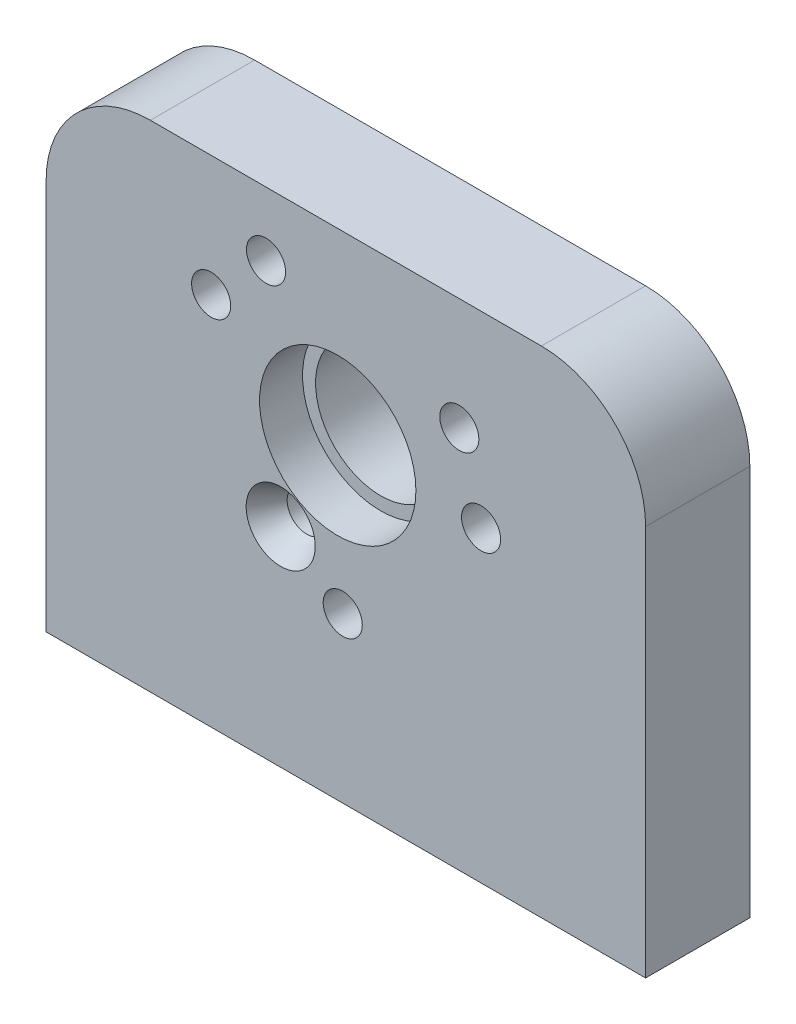
ISO-10303-21;
HEADER;
FILE_DESCRIPTION(('STEP AP214'),'2;1');
FILE_NAME('part.step','',(''),(''),'','','');
FILE_SCHEMA(('AUTOMOTIVE_DESIGN { 1 0 10303 214 1 1 1 1 }'));
ENDSEC;
DATA;
#1=APPLICATION_CONTEXT('core data for automotive mechanical design processes');
#2=APPLICATION_PROTOCOL_DEFINITION('international standard','automotive_design',2000,#1);
#3=PRODUCT_CONTEXT('',#1,'mechanical');
#4=PRODUCT('Part','Part','',(#3));
#5=PRODUCT_RELATED_PRODUCT_CATEGORY('part','',(#4));
#6=PRODUCT_DEFINITION_FORMATION('','',#4);
#7=PRODUCT_DEFINITION_CONTEXT('part definition',#1,'design');
#8=PRODUCT_DEFINITION('design','',#6,#7);
#9=PRODUCT_DEFINITION_SHAPE('','',#8);
#10=(LENGTH_UNIT() NAMED_UNIT(*) SI_UNIT(.MILLI.,.METRE.));
#11=(NAMED_UNIT(*) PLANE_ANGLE_UNIT() SI_UNIT($,.RADIAN.));
#12=(NAMED_UNIT(*) SI_UNIT($,.STERADIAN.) SOLID_ANGLE_UNIT());
#13=UNCERTAINTY_MEASURE_WITH_UNIT(LENGTH_MEASURE(1.E-05),#10,'distance_accuracy_value','');
#14=(GEOMETRIC_REPRESENTATION_CONTEXT(3) GLOBAL_UNCERTAINTY_ASSIGNED_CONTEXT((#13)) GLOBAL_UNIT_ASSIGNED_CONTEXT((#10,
#11,#12)) REPRESENTATION_CONTEXT('',''));
#15=CARTESIAN_POINT('',(0.,0.,0.));
#16=DIRECTION('',(0.,0.,1.));
#17=DIRECTION('',(1.,0.,0.));
#18=AXIS2_PLACEMENT_3D('',#15,#16,#17);
#19=CARTESIAN_POINT('',(0.,0.,-3.5));
#20=DIRECTION('',(0.,0.,1.));
#21=DIRECTION('',(1.,0.,0.));
#22=AXIS2_PLACEMENT_3D('',#19,#20,#21);
#23=PLANE('',#22);
#24=CARTESIAN_POINT('',(-6.12499999999999,15.1040017247427,-3.5));
#25=DIRECTION('',(0.,0.,-1.));
#26=DIRECTION('',(-1.,0.,0.));
#27=AXIS2_PLACEMENT_3D('',#24,#25,#26);
#28=CIRCLE('',#27,2.7);
#29=CARTESIAN_POINT('',(-8.82499999999999,15.1040017247427,-3.5));
#30=VERTEX_POINT('',#29);
#31=EDGE_CURVE('E744',#30,#30,#28,.T.);
#32=ORIENTED_EDGE('',*,*,#31,.F.);
#33=EDGE_LOOP('',(#32));
#34=FACE_BOUND('',#33,.T.);
#35=CARTESIAN_POINT('',(10.375,5.57772228311383,-3.5));
#36=DIRECTION('',(0.,0.,-1.));
#37=DIRECTION('',(-1.,0.,0.));
#38=AXIS2_PLACEMENT_3D('',#35,#36,#37);
#39=CIRCLE('',#38,2.7);
#40=CARTESIAN_POINT('',(7.67500000000001,5.57772228311383,-3.5));
#41=VERTEX_POINT('',#40);
#42=EDGE_CURVE('E273',#41,#41,#39,.T.);
#43=ORIENTED_EDGE('',*,*,#42,.F.);
#44=EDGE_LOOP('',(#43));
#45=FACE_BOUND('',#44,.T.);
#46=CARTESIAN_POINT('',(-0.241105536265653,-5.41557681429202,-3.5));
#47=DIRECTION('',(0.,0.,-1.));
#48=DIRECTION('',(-1.,0.,0.));
#49=AXIS2_PLACEMENT_3D('',#46,#47,#48);
#50=CIRCLE('',#49,2.7);
#51=CARTESIAN_POINT('',(-2.94110553626565,-5.41557681429202,-3.5));
#52=VERTEX_POINT('',#51);
#53=EDGE_CURVE('E226',#52,#52,#50,.T.);
#54=ORIENTED_EDGE('',*,*,#53,.F.);
#55=EDGE_LOOP('',(#54));
#56=FACE_BOUND('',#55,.T.);
#57=CARTESIAN_POINT('',(8.70352905788683,11.4068341897829,-3.5));
#58=DIRECTION('',(0.,0.,-1.));
#59=DIRECTION('',(-1.,0.,0.));
#60=AXIS2_PLACEMENT_3D('',#57,#58,#59);
#61=CIRCLE('',#60,2.7);
#62=CARTESIAN_POINT('',(6.00352905788683,11.4068341897829,-3.5));
#63=VERTEX_POINT('',#62);
#64=EDGE_CURVE('E266',#63,#63,#61,.T.);
#65=ORIENTED_EDGE('',*,*,#64,.F.);
#66=EDGE_LOOP('',(#65));
#67=FACE_BOUND('',#66,.T.);
#68=CARTESIAN_POINT('',(-10.3374235216212,10.7419094738506,-3.5));
#69=DIRECTION('',(0.,0.,-1.));
#70=DIRECTION('',(-1.,0.,0.));
#71=AXIS2_PLACEMENT_3D('',#68,#69,#70);
#72=CIRCLE('',#71,2.7);
#73=CARTESIAN_POINT('',(-13.0374235216212,10.7419094738506,-3.5));
#74=VERTEX_POINT('',#73);
#75=EDGE_CURVE('E231',#74,#74,#72,.T.);
#76=ORIENTED_EDGE('',*,*,#75,.F.);
#77=EDGE_LOOP('',(#76));
#78=FACE_BOUND('',#77,.T.);
#79=DIRECTION('',(-1.,0.,0.));
#80=VECTOR('',#79,1.);
#81=CARTESIAN_POINT('',(23.,20.,-3.5));
#82=LINE('',#81,#80);
#83=CARTESIAN_POINT('',(15.,20.,-3.5));
#84=VERTEX_POINT('',#83);
#85=CARTESIAN_POINT('',(-15.,20.,-3.5));
#86=VERTEX_POINT('',#85);
#87=EDGE_CURVE('E175',#84,#86,#82,.T.);
#88=ORIENTED_EDGE('',*,*,#87,.F.);
#89=CARTESIAN_POINT('',(15.,12.,-3.5));
#90=DIRECTION('',(0.,0.,1.));
#91=DIRECTION('',(1.,0.,0.));
#92=AXIS2_PLACEMENT_3D('',#89,#90,#91);
#93=CIRCLE('',#92,8.);
#94=CARTESIAN_POINT('',(23.,12.,-3.5));
#95=VERTEX_POINT('',#94);
#96=EDGE_CURVE('E208',#84,#95,#93,.F.);
#97=ORIENTED_EDGE('',*,*,#96,.T.);
#98=DIRECTION('',(0.,1.,0.));
#99=VECTOR('',#98,1.);
#100=CARTESIAN_POINT('',(23.,-18.,-3.5));
#101=LINE('',#100,#99);
#102=CARTESIAN_POINT('',(23.,-18.,-3.5));
#103=VERTEX_POINT('',#102);
#104=EDGE_CURVE('E171',#103,#95,#101,.T.);
#105=ORIENTED_EDGE('',*,*,#104,.F.);
#106=DIRECTION('',(1.,0.,0.));
#107=VECTOR('',#106,1.);
#108=CARTESIAN_POINT('',(-23.,-18.,-3.5));
#109=LINE('',#108,#107);
#110=CARTESIAN_POINT('',(-23.,-18.,-3.5));
#111=VERTEX_POINT('',#110);
#112=EDGE_CURVE('E168',#111,#103,#109,.T.);
#113=ORIENTED_EDGE('',*,*,#112,.F.);
#114=DIRECTION('',(0.,-1.,0.));
#115=VECTOR('',#114,1.);
#116=CARTESIAN_POINT('',(-23.,20.,-3.5));
#117=LINE('',#116,#115);
#118=CARTESIAN_POINT('',(-23.,12.,-3.5));
#119=VERTEX_POINT('',#118);
#120=EDGE_CURVE('E178',#119,#111,#117,.T.);
#121=ORIENTED_EDGE('',*,*,#120,.F.);
#122=CARTESIAN_POINT('',(-15.,12.,-3.5));
#123=DIRECTION('',(0.,0.,1.));
#124=DIRECTION('',(1.,0.,0.));
#125=AXIS2_PLACEMENT_3D('',#122,#123,#124);
#126=CIRCLE('',#125,8.);
#127=EDGE_CURVE('E206',#119,#86,#126,.F.);
#128=ORIENTED_EDGE('',*,*,#127,.T.);
#129=EDGE_LOOP('',(#88,#97,#105,#113,#121,#128));
#130=FACE_BOUND('',#129,.T.);
#131=CARTESIAN_POINT('',(-0.625000000000001,5.57772228311384,-3.5));
#132=DIRECTION('',(0.,0.,1.));
#133=DIRECTION('',(1.,0.,0.));
#134=AXIS2_PLACEMENT_3D('',#131,#132,#133);
#135=CIRCLE('',#134,5.00000000000001);
#136=CARTESIAN_POINT('',(4.37500000000001,5.57772228311384,-3.5));
#137=VERTEX_POINT('',#136);
#138=EDGE_CURVE('E299',#137,#137,#135,.T.);
#139=ORIENTED_EDGE('',*,*,#138,.T.);
#140=EDGE_LOOP('',(#139));
#141=FACE_BOUND('',#140,.T.);
#142=DIRECTION('',(-1.,0.,0.));
#143=VECTOR('',#142,1.);
#144=CARTESIAN_POINT('',(-2.5,-4.5,-3.5));
#145=LINE('',#144,#143);
#146=CARTESIAN_POINT('',(-3.5,-4.5,-3.5));
#147=VERTEX_POINT('',#146);
#148=CARTESIAN_POINT('',(-6.5,-4.5,-3.5));
#149=VERTEX_POINT('',#148);
#150=EDGE_CURVE('E311',#147,#149,#145,.T.);
#151=ORIENTED_EDGE('',*,*,#150,.F.);
#152=CARTESIAN_POINT('',(-3.5,-3.5,-3.5));
#153=DIRECTION('',(0.,0.,1.));
#154=DIRECTION('',(1.,0.,0.));
#155=AXIS2_PLACEMENT_3D('',#152,#153,#154);
#156=CIRCLE('',#155,1.);
#157=CARTESIAN_POINT('',(-2.5,-3.5,-3.5));
#158=VERTEX_POINT('',#157);
#159=EDGE_CURVE('E260',#147,#158,#156,.T.);
#160=ORIENTED_EDGE('',*,*,#159,.T.);
#161=DIRECTION('',(0.,-1.,0.));
#162=VECTOR('',#161,1.);
#163=CARTESIAN_POINT('',(-2.5,-4.5,-3.5));
#164=LINE('',#163,#162);
#165=CARTESIAN_POINT('',(-2.5,-0.500000000000002,-3.5));
#166=VERTEX_POINT('',#165);
#167=EDGE_CURVE('E323',#166,#158,#164,.T.);
#168=ORIENTED_EDGE('',*,*,#167,.F.);
#169=CARTESIAN_POINT('',(-3.5,-0.500000000000002,-3.5));
#170=DIRECTION('',(0.,0.,1.));
#171=DIRECTION('',(1.,0.,0.));
#172=AXIS2_PLACEMENT_3D('',#169,#170,#171);
#173=CIRCLE('',#172,1.);
#174=CARTESIAN_POINT('',(-3.5,0.499999999999998,-3.5));
#175=VERTEX_POINT('',#174);
#176=EDGE_CURVE('E11',#166,#175,#173,.T.);
#177=ORIENTED_EDGE('',*,*,#176,.T.);
#178=DIRECTION('',(1.,0.,0.));
#179=VECTOR('',#178,1.);
#180=CARTESIAN_POINT('',(-2.5,0.499999999999998,-3.5));
#181=LINE('',#180,#179);
#182=CARTESIAN_POINT('',(-6.5,0.499999999999998,-3.5));
#183=VERTEX_POINT('',#182);
#184=EDGE_CURVE('E321',#183,#175,#181,.T.);
#185=ORIENTED_EDGE('',*,*,#184,.F.);
#186=CARTESIAN_POINT('',(-6.5,-0.500000000000002,-3.5));
#187=DIRECTION('',(0.,0.,1.));
#188=DIRECTION('',(1.,0.,0.));
#189=AXIS2_PLACEMENT_3D('',#186,#187,#188);
#190=CIRCLE('',#189,1.);
#191=CARTESIAN_POINT('',(-7.5,-0.500000000000001,-3.5));
#192=VERTEX_POINT('',#191);
#193=EDGE_CURVE('E44',#183,#192,#190,.T.);
#194=ORIENTED_EDGE('',*,*,#193,.T.);
#195=DIRECTION('',(0.,1.,0.));
#196=VECTOR('',#195,1.);
#197=CARTESIAN_POINT('',(-7.5,-4.5,-3.5));
#198=LINE('',#197,#196);
#199=CARTESIAN_POINT('',(-7.5,-3.5,-3.5));
#200=VERTEX_POINT('',#199);
#201=EDGE_CURVE('E216',#200,#192,#198,.T.);
#202=ORIENTED_EDGE('',*,*,#201,.F.);
#203=CARTESIAN_POINT('',(-6.5,-3.5,-3.5));
#204=DIRECTION('',(0.,0.,1.));
#205=DIRECTION('',(1.,0.,0.));
#206=AXIS2_PLACEMENT_3D('',#203,#204,#205);
#207=CIRCLE('',#206,1.);
#208=EDGE_CURVE('E262',#200,#149,#207,.T.);
#209=ORIENTED_EDGE('',*,*,#208,.T.);
#210=EDGE_LOOP('',(#151,#160,#168,#177,#185,#194,#202,#209));
#211=FACE_BOUND('',#210,.T.);
#212=ADVANCED_FACE('F34',(#34,#45,#56,#67,#78,#130,#141,#211),#23,.F.);
#213=CARTESIAN_POINT('',(-23.,-18.,-3.5));
#214=DIRECTION('',(0.,-1.,0.));
#215=DIRECTION('',(0.,0.,-1.));
#216=AXIS2_PLACEMENT_3D('',#213,#214,#215);
#217=PLANE('',#216);
#218=CARTESIAN_POINT('',(-19.,-18.,0.5));
#219=DIRECTION('',(0.,-1.,0.));
#220=DIRECTION('',(0.,0.,-1.));
#221=AXIS2_PLACEMENT_3D('',#218,#219,#220);
#222=CIRCLE('',#221,1.24999999999999);
#223=CARTESIAN_POINT('',(-19.,-18.,-0.74999999999999));
#224=VERTEX_POINT('',#223);
#225=EDGE_CURVE('E149',#224,#224,#222,.T.);
#226=ORIENTED_EDGE('',*,*,#225,.F.);
#227=EDGE_LOOP('',(#226));
#228=FACE_BOUND('',#227,.T.);
#229=CARTESIAN_POINT('',(19.,-18.,0.5));
#230=DIRECTION('',(0.,-1.,0.));
#231=DIRECTION('',(0.,0.,-1.));
#232=AXIS2_PLACEMENT_3D('',#229,#230,#231);
#233=CIRCLE('',#232,1.24999999999999);
#234=CARTESIAN_POINT('',(19.,-18.,-0.74999999999999));
#235=VERTEX_POINT('',#234);
#236=EDGE_CURVE('E148',#235,#235,#233,.T.);
#237=ORIENTED_EDGE('',*,*,#236,.F.);
#238=EDGE_LOOP('',(#237));
#239=FACE_BOUND('',#238,.T.);
#240=CARTESIAN_POINT('',(0.,-18.,0.5));
#241=DIRECTION('',(0.,-1.,0.));
#242=DIRECTION('',(0.,0.,-1.));
#243=AXIS2_PLACEMENT_3D('',#240,#241,#242);
#244=CIRCLE('',#243,1.25);
#245=CARTESIAN_POINT('',(0.,-18.,-0.749999999999998));
#246=VERTEX_POINT('',#245);
#247=EDGE_CURVE('E161',#246,#246,#244,.T.);
#248=ORIENTED_EDGE('',*,*,#247,.F.);
#249=EDGE_LOOP('',(#248));
#250=FACE_BOUND('',#249,.T.);
#251=DIRECTION('',(1.,0.,0.));
#252=VECTOR('',#251,1.);
#253=CARTESIAN_POINT('',(-23.,-18.,4.5));
#254=LINE('',#253,#252);
#255=CARTESIAN_POINT('',(-23.,-18.,4.5));
#256=VERTEX_POINT('',#255);
#257=CARTESIAN_POINT('',(23.,-18.,4.5));
#258=VERTEX_POINT('',#257);
#259=EDGE_CURVE('E167',#256,#258,#254,.T.);
#260=ORIENTED_EDGE('',*,*,#259,.F.);
#261=DIRECTION('',(0.,0.,1.));
#262=VECTOR('',#261,1.);
#263=CARTESIAN_POINT('',(-23.,-18.,-3.5));
#264=LINE('',#263,#262);
#265=EDGE_CURVE('E190',#111,#256,#264,.T.);
#266=ORIENTED_EDGE('',*,*,#265,.F.);
#267=ORIENTED_EDGE('',*,*,#112,.T.);
#268=DIRECTION('',(0.,0.,1.));
#269=VECTOR('',#268,1.);
#270=CARTESIAN_POINT('',(23.,-18.,-3.5));
#271=LINE('',#270,#269);
#272=EDGE_CURVE('E180',#103,#258,#271,.T.);
#273=ORIENTED_EDGE('',*,*,#272,.T.);
#274=EDGE_LOOP('',(#260,#266,#267,#273));
#275=FACE_BOUND('',#274,.T.);
#276=ADVANCED_FACE('F363',(#228,#239,#250,#275),#217,.T.);
#277=CARTESIAN_POINT('',(-23.,20.,-3.5));
#278=DIRECTION('',(-1.,0.,0.));
#279=DIRECTION('',(0.,-1.,0.));
#280=AXIS2_PLACEMENT_3D('',#277,#278,#279);
#281=PLANE('',#280);
#282=DIRECTION('',(0.,-1.,0.));
#283=VECTOR('',#282,1.);
#284=CARTESIAN_POINT('',(-23.,20.,4.5));
#285=LINE('',#284,#283);
#286=CARTESIAN_POINT('',(-23.,12.,4.5));
#287=VERTEX_POINT('',#286);
#288=EDGE_CURVE('E172',#287,#256,#285,.T.);
#289=ORIENTED_EDGE('',*,*,#288,.F.);
#290=DIRECTION('',(0.,0.,1.));
#291=VECTOR('',#290,1.);
#292=CARTESIAN_POINT('',(-23.,12.,-3.5));
#293=LINE('',#292,#291);
#294=EDGE_CURVE('E210',#287,#119,#293,.F.);
#295=ORIENTED_EDGE('',*,*,#294,.T.);
#296=ORIENTED_EDGE('',*,*,#120,.T.);
#297=ORIENTED_EDGE('',*,*,#265,.T.);
#298=EDGE_LOOP('',(#289,#295,#296,#297));
#299=FACE_BOUND('',#298,.T.);
#300=ADVANCED_FACE('F369',(#299),#281,.T.);
#301=CARTESIAN_POINT('',(23.,20.,-3.5));
#302=DIRECTION('',(0.,1.,0.));
#303=DIRECTION('',(-1.,0.,0.));
#304=AXIS2_PLACEMENT_3D('',#301,#302,#303);
#305=PLANE('',#304);
#306=DIRECTION('',(-1.,0.,0.));
#307=VECTOR('',#306,1.);
#308=CARTESIAN_POINT('',(23.,20.,4.5));
#309=LINE('',#308,#307);
#310=CARTESIAN_POINT('',(15.,20.,4.5));
#311=VERTEX_POINT('',#310);
#312=CARTESIAN_POINT('',(-15.,20.,4.5));
#313=VERTEX_POINT('',#312);
#314=EDGE_CURVE('E186',#311,#313,#309,.T.);
#315=ORIENTED_EDGE('',*,*,#314,.F.);
#316=DIRECTION('',(0.,0.,1.));
#317=VECTOR('',#316,1.);
#318=CARTESIAN_POINT('',(15.,20.,-3.5));
#319=LINE('',#318,#317);
#320=EDGE_CURVE('E204',#311,#84,#319,.F.);
#321=ORIENTED_EDGE('',*,*,#320,.T.);
#322=ORIENTED_EDGE('',*,*,#87,.T.);
#323=DIRECTION('',(0.,0.,1.));
#324=VECTOR('',#323,1.);
#325=CARTESIAN_POINT('',(-15.,20.,-3.5));
#326=LINE('',#325,#324);
#327=EDGE_CURVE('E201',#86,#313,#326,.T.);
#328=ORIENTED_EDGE('',*,*,#327,.T.);
#329=EDGE_LOOP('',(#315,#321,#322,#328));
#330=FACE_BOUND('',#329,.T.);
#331=ADVANCED_FACE('F385',(#330),#305,.T.);
#332=CARTESIAN_POINT('',(23.,-18.,-3.5));
#333=DIRECTION('',(1.,0.,0.));
#334=DIRECTION('',(0.,0.,-1.));
#335=AXIS2_PLACEMENT_3D('',#332,#333,#334);
#336=PLANE('',#335);
#337=ORIENTED_EDGE('',*,*,#104,.T.);
#338=DIRECTION('',(0.,0.,1.));
#339=VECTOR('',#338,1.);
#340=CARTESIAN_POINT('',(23.,12.,-3.5));
#341=LINE('',#340,#339);
#342=CARTESIAN_POINT('',(23.,12.,4.5));
#343=VERTEX_POINT('',#342);
#344=EDGE_CURVE('E193',#95,#343,#341,.T.);
#345=ORIENTED_EDGE('',*,*,#344,.T.);
#346=DIRECTION('',(0.,1.,0.));
#347=VECTOR('',#346,1.);
#348=CARTESIAN_POINT('',(23.,-18.,4.5));
#349=LINE('',#348,#347);
#350=EDGE_CURVE('E183',#258,#343,#349,.T.);
#351=ORIENTED_EDGE('',*,*,#350,.F.);
#352=ORIENTED_EDGE('',*,*,#272,.F.);
#353=EDGE_LOOP('',(#337,#345,#351,#352));
#354=FACE_BOUND('',#353,.T.);
#355=ADVANCED_FACE('F381',(#354),#336,.T.);
#356=CARTESIAN_POINT('',(0.,0.,4.5));
#357=DIRECTION('',(0.,0.,1.));
#358=DIRECTION('',(1.,0.,0.));
#359=AXIS2_PLACEMENT_3D('',#356,#357,#358);
#360=PLANE('',#359);
#361=CARTESIAN_POINT('',(-6.12499999999999,15.1040017247427,4.5));
#362=DIRECTION('',(0.,0.,1.));
#363=DIRECTION('',(1.,0.,0.));
#364=AXIS2_PLACEMENT_3D('',#361,#362,#363);
#365=CIRCLE('',#364,1.49999999999999);
#366=CARTESIAN_POINT('',(-4.625,15.1040017247427,4.5));
#367=VERTEX_POINT('',#366);
#368=EDGE_CURVE('E38',#367,#367,#365,.T.);
#369=ORIENTED_EDGE('',*,*,#368,.F.);
#370=EDGE_LOOP('',(#369));
#371=FACE_BOUND('',#370,.T.);
#372=CARTESIAN_POINT('',(10.375,5.57772228311383,4.5));
#373=DIRECTION('',(0.,0.,1.));
#374=DIRECTION('',(1.,0.,0.));
#375=AXIS2_PLACEMENT_3D('',#372,#373,#374);
#376=CIRCLE('',#375,1.49999999999999);
#377=CARTESIAN_POINT('',(11.875,5.57772228311383,4.5));
#378=VERTEX_POINT('',#377);
#379=EDGE_CURVE('E264',#378,#378,#376,.T.);
#380=ORIENTED_EDGE('',*,*,#379,.F.);
#381=EDGE_LOOP('',(#380));
#382=FACE_BOUND('',#381,.T.);
#383=CARTESIAN_POINT('',(8.70352905788683,11.4068341897829,4.5));
#384=DIRECTION('',(0.,0.,1.));
#385=DIRECTION('',(1.,0.,0.));
#386=AXIS2_PLACEMENT_3D('',#383,#384,#385);
#387=CIRCLE('',#386,1.5);
#388=CARTESIAN_POINT('',(10.2035290578868,11.4068341897829,4.5));
#389=VERTEX_POINT('',#388);
#390=EDGE_CURVE('E228',#389,#389,#387,.T.);
#391=ORIENTED_EDGE('',*,*,#390,.F.);
#392=EDGE_LOOP('',(#391));
#393=FACE_BOUND('',#392,.T.);
#394=CARTESIAN_POINT('',(-10.3374235216212,10.7419094738506,4.5));
#395=DIRECTION('',(0.,0.,1.));
#396=DIRECTION('',(1.,0.,0.));
#397=AXIS2_PLACEMENT_3D('',#394,#395,#396);
#398=CIRCLE('',#397,1.5);
#399=CARTESIAN_POINT('',(-8.83742352162118,10.7419094738506,4.5));
#400=VERTEX_POINT('',#399);
#401=EDGE_CURVE('E223',#400,#400,#398,.T.);
#402=ORIENTED_EDGE('',*,*,#401,.F.);
#403=EDGE_LOOP('',(#402));
#404=FACE_BOUND('',#403,.T.);
#405=CARTESIAN_POINT('',(-0.241105536265653,-5.41557681429202,4.5));
#406=DIRECTION('',(0.,0.,1.));
#407=DIRECTION('',(1.,0.,0.));
#408=AXIS2_PLACEMENT_3D('',#405,#406,#407);
#409=CIRCLE('',#408,1.5);
#410=CARTESIAN_POINT('',(1.25889446373435,-5.41557681429202,4.5));
#411=VERTEX_POINT('',#410);
#412=EDGE_CURVE('E218',#411,#411,#409,.T.);
#413=ORIENTED_EDGE('',*,*,#412,.F.);
#414=EDGE_LOOP('',(#413));
#415=FACE_BOUND('',#414,.T.);
#416=CARTESIAN_POINT('',(-0.625000000000001,5.57772228311384,4.5));
#417=DIRECTION('',(0.,0.,1.));
#418=DIRECTION('',(1.,0.,0.));
#419=AXIS2_PLACEMENT_3D('',#416,#417,#418);
#420=CIRCLE('',#419,6.00000000000001);
#421=CARTESIAN_POINT('',(5.37500000000001,5.57772228311384,4.5));
#422=VERTEX_POINT('',#421);
#423=EDGE_CURVE('E221',#422,#422,#420,.T.);
#424=ORIENTED_EDGE('',*,*,#423,.F.);
#425=EDGE_LOOP('',(#424));
#426=FACE_BOUND('',#425,.T.);
#427=CARTESIAN_POINT('',(-5.,-2.,4.5));
#428=DIRECTION('',(0.,0.,1.));
#429=DIRECTION('',(1.,0.,0.));
#430=AXIS2_PLACEMENT_3D('',#427,#428,#429);
#431=CIRCLE('',#430,2.65);
#432=CARTESIAN_POINT('',(-2.35,-2.,4.5));
#433=VERTEX_POINT('',#432);
#434=EDGE_CURVE('E302',#433,#433,#431,.T.);
#435=ORIENTED_EDGE('',*,*,#434,.F.);
#436=EDGE_LOOP('',(#435));
#437=FACE_BOUND('',#436,.T.);
#438=ORIENTED_EDGE('',*,*,#350,.T.);
#439=CARTESIAN_POINT('',(15.,12.,4.5));
#440=DIRECTION('',(0.,0.,1.));
#441=DIRECTION('',(1.,0.,0.));
#442=AXIS2_PLACEMENT_3D('',#439,#440,#441);
#443=CIRCLE('',#442,8.);
#444=EDGE_CURVE('E199',#343,#311,#443,.T.);
#445=ORIENTED_EDGE('',*,*,#444,.T.);
#446=ORIENTED_EDGE('',*,*,#314,.T.);
#447=CARTESIAN_POINT('',(-15.,12.,4.5));
#448=DIRECTION('',(0.,0.,1.));
#449=DIRECTION('',(1.,0.,0.));
#450=AXIS2_PLACEMENT_3D('',#447,#448,#449);
#451=CIRCLE('',#450,8.);
#452=EDGE_CURVE('E197',#313,#287,#451,.T.);
#453=ORIENTED_EDGE('',*,*,#452,.T.);
#454=ORIENTED_EDGE('',*,*,#288,.T.);
#455=ORIENTED_EDGE('',*,*,#259,.T.);
#456=EDGE_LOOP('',(#438,#445,#446,#453,#454,#455));
#457=FACE_BOUND('',#456,.T.);
#458=ADVANCED_FACE('F378',(#371,#382,#393,#404,#415,#426,#437,#457),#360,.T.);
#459=CARTESIAN_POINT('',(0.,-10.,0.5));
#460=DIRECTION('',(0.,-1.,0.));
#461=DIRECTION('',(0.,0.,-1.));
#462=AXIS2_PLACEMENT_3D('',#459,#460,#461);
#463=CONICAL_SURFACE('',#462,1.25,1.02974425867665);
#464=CARTESIAN_POINT('',(0.,-9.24892422621555,0.5));
#465=VERTEX_POINT('',#464);
#466=VERTEX_LOOP('',#465);
#467=FACE_BOUND('',#466,.T.);
#468=CARTESIAN_POINT('',(0.,-10.,0.5));
#469=DIRECTION('',(0.,-1.,0.));
#470=DIRECTION('',(0.,0.,-1.));
#471=AXIS2_PLACEMENT_3D('',#468,#469,#470);
#472=CIRCLE('',#471,1.25);
#473=CARTESIAN_POINT('',(0.,-10.,-0.749999999999997));
#474=VERTEX_POINT('',#473);
#475=EDGE_CURVE('E164',#474,#474,#472,.T.);
#476=ORIENTED_EDGE('',*,*,#475,.T.);
#477=EDGE_LOOP('',(#476));
#478=FACE_BOUND('',#477,.T.);
#479=ADVANCED_FACE('F376',(#467,#478),#463,.F.);
#480=CARTESIAN_POINT('',(0.,-18.,0.5));
#481=DIRECTION('',(0.,-1.,0.));
#482=DIRECTION('',(0.,0.,-1.));
#483=AXIS2_PLACEMENT_3D('',#480,#481,#482);
#484=CYLINDRICAL_SURFACE('',#483,1.25);
#485=ORIENTED_EDGE('',*,*,#475,.F.);
#486=EDGE_LOOP('',(#485));
#487=FACE_BOUND('',#486,.T.);
#488=ORIENTED_EDGE('',*,*,#247,.T.);
#489=EDGE_LOOP('',(#488));
#490=FACE_BOUND('',#489,.T.);
#491=ADVANCED_FACE('F484',(#487,#490),#484,.F.);
#492=CARTESIAN_POINT('',(19.,-10.,0.5));
#493=DIRECTION('',(0.,-1.,0.));
#494=DIRECTION('',(0.,0.,-1.));
#495=AXIS2_PLACEMENT_3D('',#492,#493,#494);
#496=CONICAL_SURFACE('',#495,1.25,1.02974425867665);
#497=CARTESIAN_POINT('',(19.,-9.24892422621555,0.5));
#498=VERTEX_POINT('',#497);
#499=VERTEX_LOOP('',#498);
#500=FACE_BOUND('',#499,.T.);
#501=CARTESIAN_POINT('',(19.,-10.,0.5));
#502=DIRECTION('',(0.,-1.,0.));
#503=DIRECTION('',(0.,0.,-1.));
#504=AXIS2_PLACEMENT_3D('',#501,#502,#503);
#505=CIRCLE('',#504,1.25);
#506=CARTESIAN_POINT('',(19.,-10.,-0.749999999999997));
#507=VERTEX_POINT('',#506);
#508=EDGE_CURVE('E152',#507,#507,#505,.T.);
#509=ORIENTED_EDGE('',*,*,#508,.T.);
#510=EDGE_LOOP('',(#509));
#511=FACE_BOUND('',#510,.T.);
#512=ADVANCED_FACE('F481',(#500,#511),#496,.F.);
#513=CARTESIAN_POINT('',(19.,-18.,0.5));
#514=DIRECTION('',(0.,-1.,0.));
#515=DIRECTION('',(0.,0.,-1.));
#516=AXIS2_PLACEMENT_3D('',#513,#514,#515);
#517=CYLINDRICAL_SURFACE('',#516,1.24999999999999);
#518=ORIENTED_EDGE('',*,*,#508,.F.);
#519=EDGE_LOOP('',(#518));
#520=FACE_BOUND('',#519,.T.);
#521=ORIENTED_EDGE('',*,*,#236,.T.);
#522=EDGE_LOOP('',(#521));
#523=FACE_BOUND('',#522,.T.);
#524=ADVANCED_FACE('F142',(#520,#523),#517,.F.);
#525=CARTESIAN_POINT('',(-19.,-10.,0.5));
#526=DIRECTION('',(0.,-1.,0.));
#527=DIRECTION('',(0.,0.,-1.));
#528=AXIS2_PLACEMENT_3D('',#525,#526,#527);
#529=CONICAL_SURFACE('',#528,1.25,1.02974425867665);
#530=CARTESIAN_POINT('',(-19.,-9.24892422621555,0.5));
#531=VERTEX_POINT('',#530);
#532=VERTEX_LOOP('',#531);
#533=FACE_BOUND('',#532,.T.);
#534=CARTESIAN_POINT('',(-19.,-10.,0.5));
#535=DIRECTION('',(0.,-1.,0.));
#536=DIRECTION('',(0.,0.,-1.));
#537=AXIS2_PLACEMENT_3D('',#534,#535,#536);
#538=CIRCLE('',#537,1.25);
#539=CARTESIAN_POINT('',(-19.,-10.,-0.749999999999997));
#540=VERTEX_POINT('',#539);
#541=EDGE_CURVE('E146',#540,#540,#538,.T.);
#542=ORIENTED_EDGE('',*,*,#541,.T.);
#543=EDGE_LOOP('',(#542));
#544=FACE_BOUND('',#543,.T.);
#545=ADVANCED_FACE('F138',(#533,#544),#529,.F.);
#546=CARTESIAN_POINT('',(-19.,-18.,0.5));
#547=DIRECTION('',(0.,-1.,0.));
#548=DIRECTION('',(0.,0.,-1.));
#549=AXIS2_PLACEMENT_3D('',#546,#547,#548);
#550=CYLINDRICAL_SURFACE('',#549,1.24999999999999);
#551=ORIENTED_EDGE('',*,*,#541,.F.);
#552=EDGE_LOOP('',(#551));
#553=FACE_BOUND('',#552,.T.);
#554=ORIENTED_EDGE('',*,*,#225,.T.);
#555=EDGE_LOOP('',(#554));
#556=FACE_BOUND('',#555,.T.);
#557=ADVANCED_FACE('F141',(#553,#556),#550,.F.);
#558=CARTESIAN_POINT('',(15.,12.,-3.5));
#559=DIRECTION('',(0.,0.,1.));
#560=DIRECTION('',(1.,0.,0.));
#561=AXIS2_PLACEMENT_3D('',#558,#559,#560);
#562=CYLINDRICAL_SURFACE('',#561,8.);
#563=ORIENTED_EDGE('',*,*,#96,.F.);
#564=ORIENTED_EDGE('',*,*,#320,.F.);
#565=ORIENTED_EDGE('',*,*,#444,.F.);
#566=ORIENTED_EDGE('',*,*,#344,.F.);
#567=EDGE_LOOP('',(#563,#564,#565,#566));
#568=FACE_BOUND('',#567,.T.);
#569=ADVANCED_FACE('F393',(#568),#562,.T.);
#570=CARTESIAN_POINT('',(-15.,12.,-3.5));
#571=DIRECTION('',(0.,0.,1.));
#572=DIRECTION('',(1.,0.,0.));
#573=AXIS2_PLACEMENT_3D('',#570,#571,#572);
#574=CYLINDRICAL_SURFACE('',#573,8.);
#575=ORIENTED_EDGE('',*,*,#127,.F.);
#576=ORIENTED_EDGE('',*,*,#294,.F.);
#577=ORIENTED_EDGE('',*,*,#452,.F.);
#578=ORIENTED_EDGE('',*,*,#327,.F.);
#579=EDGE_LOOP('',(#575,#576,#577,#578));
#580=FACE_BOUND('',#579,.T.);
#581=ADVANCED_FACE('F396',(#580),#574,.T.);
#582=CARTESIAN_POINT('',(-7.5,-4.5,1.));
#583=DIRECTION('',(-1.,0.,0.));
#584=DIRECTION('',(0.,-1.,0.));
#585=AXIS2_PLACEMENT_3D('',#582,#583,#584);
#586=PLANE('',#585);
#587=DIRECTION('',(0.,1.,0.));
#588=VECTOR('',#587,1.);
#589=CARTESIAN_POINT('',(-7.5,-4.5,1.));
#590=LINE('',#589,#588);
#591=CARTESIAN_POINT('',(-7.5,-3.5,1.));
#592=VERTEX_POINT('',#591);
#593=CARTESIAN_POINT('',(-7.5,-0.500000000000001,1.));
#594=VERTEX_POINT('',#593);
#595=EDGE_CURVE('E307',#592,#594,#590,.T.);
#596=ORIENTED_EDGE('',*,*,#595,.F.);
#597=DIRECTION('',(0.,0.,-1.));
#598=VECTOR('',#597,1.);
#599=CARTESIAN_POINT('',(-7.5,-3.5,-3.5));
#600=LINE('',#599,#598);
#601=EDGE_CURVE('E252',#592,#200,#600,.T.);
#602=ORIENTED_EDGE('',*,*,#601,.T.);
#603=ORIENTED_EDGE('',*,*,#201,.T.);
#604=DIRECTION('',(0.,0.,-1.));
#605=VECTOR('',#604,1.);
#606=CARTESIAN_POINT('',(-7.5,-0.500000000000002,1.));
#607=LINE('',#606,#605);
#608=EDGE_CURVE('E250',#192,#594,#607,.F.);
#609=ORIENTED_EDGE('',*,*,#608,.T.);
#610=EDGE_LOOP('',(#596,#602,#603,#609));
#611=FACE_BOUND('',#610,.T.);
#612=ADVANCED_FACE('F341',(#611),#586,.F.);
#613=CARTESIAN_POINT('',(-2.5,-4.5,1.));
#614=DIRECTION('',(0.,-1.,0.));
#615=DIRECTION('',(0.,0.,-1.));
#616=AXIS2_PLACEMENT_3D('',#613,#614,#615);
#617=PLANE('',#616);
#618=DIRECTION('',(-1.,0.,0.));
#619=VECTOR('',#618,1.);
#620=CARTESIAN_POINT('',(-2.5,-4.5,1.));
#621=LINE('',#620,#619);
#622=CARTESIAN_POINT('',(-3.5,-4.5,1.));
#623=VERTEX_POINT('',#622);
#624=CARTESIAN_POINT('',(-6.5,-4.5,1.));
#625=VERTEX_POINT('',#624);
#626=EDGE_CURVE('E155',#623,#625,#621,.T.);
#627=ORIENTED_EDGE('',*,*,#626,.F.);
#628=DIRECTION('',(0.,0.,-1.));
#629=VECTOR('',#628,1.);
#630=CARTESIAN_POINT('',(-3.5,-4.5,-3.0451514986919));
#631=LINE('',#630,#629);
#632=EDGE_CURVE('E234',#623,#147,#631,.T.);
#633=ORIENTED_EDGE('',*,*,#632,.T.);
#634=ORIENTED_EDGE('',*,*,#150,.T.);
#635=DIRECTION('',(0.,0.,-1.));
#636=VECTOR('',#635,1.);
#637=CARTESIAN_POINT('',(-6.5,-4.5,1.));
#638=LINE('',#637,#636);
#639=EDGE_CURVE('E212',#149,#625,#638,.F.);
#640=ORIENTED_EDGE('',*,*,#639,.T.);
#641=EDGE_LOOP('',(#627,#633,#634,#640));
#642=FACE_BOUND('',#641,.T.);
#643=ADVANCED_FACE('F330',(#642),#617,.F.);
#644=CARTESIAN_POINT('',(-2.5,-4.5,1.));
#645=DIRECTION('',(1.,0.,0.));
#646=DIRECTION('',(0.,0.,-1.));
#647=AXIS2_PLACEMENT_3D('',#644,#645,#646);
#648=PLANE('',#647);
#649=ORIENTED_EDGE('',*,*,#167,.T.);
#650=DIRECTION('',(0.,0.,-1.));
#651=VECTOR('',#650,1.);
#652=CARTESIAN_POINT('',(-2.5,-3.5,1.));
#653=LINE('',#652,#651);
#654=CARTESIAN_POINT('',(-2.5,-3.5,1.));
#655=VERTEX_POINT('',#654);
#656=EDGE_CURVE('E240',#158,#655,#653,.F.);
#657=ORIENTED_EDGE('',*,*,#656,.T.);
#658=DIRECTION('',(0.,-1.,0.));
#659=VECTOR('',#658,1.);
#660=CARTESIAN_POINT('',(-2.5,-4.5,1.));
#661=LINE('',#660,#659);
#662=CARTESIAN_POINT('',(-2.5,-0.500000000000002,1.));
#663=VERTEX_POINT('',#662);
#664=EDGE_CURVE('E314',#663,#655,#661,.T.);
#665=ORIENTED_EDGE('',*,*,#664,.F.);
#666=DIRECTION('',(0.,0.,-1.));
#667=VECTOR('',#666,1.);
#668=CARTESIAN_POINT('',(-2.5,-0.500000000000002,-3.5));
#669=LINE('',#668,#667);
#670=EDGE_CURVE('E237',#663,#166,#669,.T.);
#671=ORIENTED_EDGE('',*,*,#670,.T.);
#672=EDGE_LOOP('',(#649,#657,#665,#671));
#673=FACE_BOUND('',#672,.T.);
#674=ADVANCED_FACE('F357',(#673),#648,.F.);
#675=CARTESIAN_POINT('',(-2.5,0.499999999999998,1.));
#676=DIRECTION('',(0.,1.,0.));
#677=DIRECTION('',(0.,0.,1.));
#678=AXIS2_PLACEMENT_3D('',#675,#676,#677);
#679=PLANE('',#678);
#680=DIRECTION('',(1.,0.,0.));
#681=VECTOR('',#680,1.);
#682=CARTESIAN_POINT('',(-2.5,0.499999999999998,1.));
#683=LINE('',#682,#681);
#684=CARTESIAN_POINT('',(-6.5,0.499999999999998,1.));
#685=VERTEX_POINT('',#684);
#686=CARTESIAN_POINT('',(-3.5,0.499999999999998,1.));
#687=VERTEX_POINT('',#686);
#688=EDGE_CURVE('E310',#685,#687,#683,.T.);
#689=ORIENTED_EDGE('',*,*,#688,.F.);
#690=DIRECTION('',(0.,0.,-1.));
#691=VECTOR('',#690,1.);
#692=CARTESIAN_POINT('',(-6.5,0.499999999999998,-3.5));
#693=LINE('',#692,#691);
#694=EDGE_CURVE('E257',#685,#183,#693,.T.);
#695=ORIENTED_EDGE('',*,*,#694,.T.);
#696=ORIENTED_EDGE('',*,*,#184,.T.);
#697=DIRECTION('',(0.,0.,-1.));
#698=VECTOR('',#697,1.);
#699=CARTESIAN_POINT('',(-3.5,0.499999999999998,1.));
#700=LINE('',#699,#698);
#701=EDGE_CURVE('E255',#175,#687,#700,.F.);
#702=ORIENTED_EDGE('',*,*,#701,.T.);
#703=EDGE_LOOP('',(#689,#695,#696,#702));
#704=FACE_BOUND('',#703,.T.);
#705=ADVANCED_FACE('F350',(#704),#679,.F.);
#706=CARTESIAN_POINT('',(0.,0.,1.));
#707=DIRECTION('',(0.,0.,1.));
#708=DIRECTION('',(1.,0.,0.));
#709=AXIS2_PLACEMENT_3D('',#706,#707,#708);
#710=PLANE('',#709);
#711=CARTESIAN_POINT('',(-5.,-2.,1.));
#712=DIRECTION('',(0.,0.,1.));
#713=DIRECTION('',(1.,0.,0.));
#714=AXIS2_PLACEMENT_3D('',#711,#712,#713);
#715=CIRCLE('',#714,1.5);
#716=CARTESIAN_POINT('',(-3.5,-2.,1.));
#717=VERTEX_POINT('',#716);
#718=EDGE_CURVE('E213',#717,#717,#715,.T.);
#719=ORIENTED_EDGE('',*,*,#718,.T.);
#720=EDGE_LOOP('',(#719));
#721=FACE_BOUND('',#720,.T.);
#722=ORIENTED_EDGE('',*,*,#664,.T.);
#723=CARTESIAN_POINT('',(-3.5,-3.5,1.));
#724=DIRECTION('',(0.,0.,1.));
#725=DIRECTION('',(1.,0.,0.));
#726=AXIS2_PLACEMENT_3D('',#723,#724,#725);
#727=CIRCLE('',#726,1.);
#728=EDGE_CURVE('E248',#655,#623,#727,.F.);
#729=ORIENTED_EDGE('',*,*,#728,.T.);
#730=ORIENTED_EDGE('',*,*,#626,.T.);
#731=CARTESIAN_POINT('',(-6.5,-3.5,1.));
#732=DIRECTION('',(0.,0.,1.));
#733=DIRECTION('',(1.,0.,0.));
#734=AXIS2_PLACEMENT_3D('',#731,#732,#733);
#735=CIRCLE('',#734,1.);
#736=EDGE_CURVE('E246',#625,#592,#735,.F.);
#737=ORIENTED_EDGE('',*,*,#736,.T.);
#738=ORIENTED_EDGE('',*,*,#595,.T.);
#739=CARTESIAN_POINT('',(-6.5,-0.500000000000002,1.));
#740=DIRECTION('',(0.,0.,1.));
#741=DIRECTION('',(1.,0.,0.));
#742=AXIS2_PLACEMENT_3D('',#739,#740,#741);
#743=CIRCLE('',#742,1.);
#744=EDGE_CURVE('E244',#594,#685,#743,.F.);
#745=ORIENTED_EDGE('',*,*,#744,.T.);
#746=ORIENTED_EDGE('',*,*,#688,.T.);
#747=CARTESIAN_POINT('',(-3.5,-0.500000000000002,1.));
#748=DIRECTION('',(0.,0.,1.));
#749=DIRECTION('',(1.,0.,0.));
#750=AXIS2_PLACEMENT_3D('',#747,#748,#749);
#751=CIRCLE('',#750,1.);
#752=EDGE_CURVE('E242',#687,#663,#751,.F.);
#753=ORIENTED_EDGE('',*,*,#752,.T.);
#754=EDGE_LOOP('',(#722,#729,#730,#737,#738,#745,#746,#753));
#755=FACE_BOUND('',#754,.T.);
#756=ADVANCED_FACE('F338',(#721,#755),#710,.F.);
#757=CARTESIAN_POINT('',(-5.,-2.,4.5));
#758=DIRECTION('',(0.,0.,1.));
#759=DIRECTION('',(1.,0.,0.));
#760=AXIS2_PLACEMENT_3D('',#757,#758,#759);
#761=CYLINDRICAL_SURFACE('',#760,1.5);
#762=CARTESIAN_POINT('',(-5.,-2.,2.50814157129579));
#763=DIRECTION('',(0.,0.,1.));
#764=DIRECTION('',(1.,0.,0.));
#765=AXIS2_PLACEMENT_3D('',#762,#763,#764);
#766=CIRCLE('',#765,1.5);
#767=CARTESIAN_POINT('',(-3.5,-2.,2.50814157129579));
#768=VERTEX_POINT('',#767);
#769=EDGE_CURVE('E217',#768,#768,#766,.T.);
#770=ORIENTED_EDGE('',*,*,#769,.T.);
#771=EDGE_LOOP('',(#770));
#772=FACE_BOUND('',#771,.T.);
#773=ORIENTED_EDGE('',*,*,#718,.F.);
#774=EDGE_LOOP('',(#773));
#775=FACE_BOUND('',#774,.T.);
#776=ADVANCED_FACE('F461',(#772,#775),#761,.F.);
#777=CARTESIAN_POINT('',(-5.,-2.,4.5));
#778=DIRECTION('',(0.,0.,1.));
#779=DIRECTION('',(1.,0.,0.));
#780=AXIS2_PLACEMENT_3D('',#777,#778,#779);
#781=CONICAL_SURFACE('',#780,2.65,0.523598775598299);
#782=ORIENTED_EDGE('',*,*,#769,.F.);
#783=EDGE_LOOP('',(#782));
#784=FACE_BOUND('',#783,.T.);
#785=ORIENTED_EDGE('',*,*,#434,.T.);
#786=EDGE_LOOP('',(#785));
#787=FACE_BOUND('',#786,.T.);
#788=ADVANCED_FACE('F457',(#784,#787),#781,.F.);
#789=CARTESIAN_POINT('',(-0.625000000000001,5.57772228311384,4.5));
#790=DIRECTION('',(0.,0.,1.));
#791=DIRECTION('',(1.,0.,0.));
#792=AXIS2_PLACEMENT_3D('',#789,#790,#791);
#793=CYLINDRICAL_SURFACE('',#792,5.00000000000001);
#794=ORIENTED_EDGE('',*,*,#138,.F.);
#795=EDGE_LOOP('',(#794));
#796=FACE_BOUND('',#795,.T.);
#797=CARTESIAN_POINT('',(-0.625000000000001,5.57772228311384,1.2));
#798=DIRECTION('',(0.,0.,1.));
#799=DIRECTION('',(1.,0.,0.));
#800=AXIS2_PLACEMENT_3D('',#797,#798,#799);
#801=CIRCLE('',#800,5.00000000000001);
#802=CARTESIAN_POINT('',(4.37500000000001,5.57772228311384,1.2));
#803=VERTEX_POINT('',#802);
#804=EDGE_CURVE('E296',#803,#803,#801,.T.);
#805=ORIENTED_EDGE('',*,*,#804,.T.);
#806=EDGE_LOOP('',(#805));
#807=FACE_BOUND('',#806,.T.);
#808=ADVANCED_FACE('F453',(#796,#807),#793,.F.);
#809=CARTESIAN_POINT('',(4.37500000000001,5.57772228311384,1.2));
#810=DIRECTION('',(0.,0.,-1.));
#811=DIRECTION('',(-1.,0.,0.));
#812=AXIS2_PLACEMENT_3D('',#809,#810,#811);
#813=PLANE('',#812);
#814=ORIENTED_EDGE('',*,*,#804,.F.);
#815=EDGE_LOOP('',(#814));
#816=FACE_BOUND('',#815,.T.);
#817=CARTESIAN_POINT('',(-0.625000000000001,5.57772228311384,1.2));
#818=DIRECTION('',(0.,0.,1.));
#819=DIRECTION('',(1.,0.,0.));
#820=AXIS2_PLACEMENT_3D('',#817,#818,#819);
#821=CIRCLE('',#820,6.00000000000001);
#822=CARTESIAN_POINT('',(5.37500000000001,5.57772228311384,1.2));
#823=VERTEX_POINT('',#822);
#824=EDGE_CURVE('E293',#823,#823,#821,.T.);
#825=ORIENTED_EDGE('',*,*,#824,.T.);
#826=EDGE_LOOP('',(#825));
#827=FACE_BOUND('',#826,.T.);
#828=ADVANCED_FACE('F449',(#816,#827),#813,.F.);
#829=CARTESIAN_POINT('',(-0.625000000000001,5.57772228311384,4.5));
#830=DIRECTION('',(0.,0.,1.));
#831=DIRECTION('',(1.,0.,0.));
#832=AXIS2_PLACEMENT_3D('',#829,#830,#831);
#833=CYLINDRICAL_SURFACE('',#832,6.00000000000001);
#834=ORIENTED_EDGE('',*,*,#824,.F.);
#835=EDGE_LOOP('',(#834));
#836=FACE_BOUND('',#835,.T.);
#837=ORIENTED_EDGE('',*,*,#423,.T.);
#838=EDGE_LOOP('',(#837));
#839=FACE_BOUND('',#838,.T.);
#840=ADVANCED_FACE('F442',(#836,#839),#833,.F.);
#841=CARTESIAN_POINT('',(-0.241105536265653,-5.41557681429202,-3.5));
#842=DIRECTION('',(0.,0.,-1.));
#843=DIRECTION('',(-1.,0.,0.));
#844=AXIS2_PLACEMENT_3D('',#841,#842,#843);
#845=CONICAL_SURFACE('',#844,2.7,0.523598775598299);
#846=CARTESIAN_POINT('',(-0.241105536265653,-5.41557681429202,-1.42153903091734));
#847=DIRECTION('',(0.,0.,-1.));
#848=DIRECTION('',(-1.,0.,0.));
#849=AXIS2_PLACEMENT_3D('',#846,#847,#848);
#850=CIRCLE('',#849,1.5);
#851=CARTESIAN_POINT('',(-1.74110553626565,-5.41557681429202,-1.42153903091734));
#852=VERTEX_POINT('',#851);
#853=EDGE_CURVE('E222',#852,#852,#850,.T.);
#854=ORIENTED_EDGE('',*,*,#853,.F.);
#855=EDGE_LOOP('',(#854));
#856=FACE_BOUND('',#855,.T.);
#857=ORIENTED_EDGE('',*,*,#53,.T.);
#858=EDGE_LOOP('',(#857));
#859=FACE_BOUND('',#858,.T.);
#860=ADVANCED_FACE('F439',(#856,#859),#845,.F.);
#861=CARTESIAN_POINT('',(-0.241105536265653,-5.41557681429202,-3.5));
#862=DIRECTION('',(0.,0.,-1.));
#863=DIRECTION('',(-1.,0.,0.));
#864=AXIS2_PLACEMENT_3D('',#861,#862,#863);
#865=CYLINDRICAL_SURFACE('',#864,1.5);
#866=ORIENTED_EDGE('',*,*,#412,.T.);
#867=EDGE_LOOP('',(#866));
#868=FACE_BOUND('',#867,.T.);
#869=ORIENTED_EDGE('',*,*,#853,.T.);
#870=EDGE_LOOP('',(#869));
#871=FACE_BOUND('',#870,.T.);
#872=ADVANCED_FACE('F437',(#868,#871),#865,.F.);
#873=CARTESIAN_POINT('',(-10.3374235216212,10.7419094738506,-3.5));
#874=DIRECTION('',(0.,0.,-1.));
#875=DIRECTION('',(-1.,0.,0.));
#876=AXIS2_PLACEMENT_3D('',#873,#874,#875);
#877=CYLINDRICAL_SURFACE('',#876,1.5);
#878=ORIENTED_EDGE('',*,*,#401,.T.);
#879=EDGE_LOOP('',(#878));
#880=FACE_BOUND('',#879,.T.);
#881=CARTESIAN_POINT('',(-10.3374235216212,10.7419094738506,-1.42153903091734));
#882=DIRECTION('',(0.,0.,-1.));
#883=DIRECTION('',(-1.,0.,0.));
#884=AXIS2_PLACEMENT_3D('',#881,#882,#883);
#885=CIRCLE('',#884,1.5);
#886=CARTESIAN_POINT('',(-11.8374235216212,10.7419094738506,-1.42153903091734));
#887=VERTEX_POINT('',#886);
#888=EDGE_CURVE('E227',#887,#887,#885,.T.);
#889=ORIENTED_EDGE('',*,*,#888,.T.);
#890=EDGE_LOOP('',(#889));
#891=FACE_BOUND('',#890,.T.);
#892=ADVANCED_FACE('F433',(#880,#891),#877,.F.);
#893=CARTESIAN_POINT('',(-10.3374235216212,10.7419094738506,-3.5));
#894=DIRECTION('',(0.,0.,-1.));
#895=DIRECTION('',(-1.,0.,0.));
#896=AXIS2_PLACEMENT_3D('',#893,#894,#895);
#897=CONICAL_SURFACE('',#896,2.7,0.523598775598299);
#898=ORIENTED_EDGE('',*,*,#888,.F.);
#899=EDGE_LOOP('',(#898));
#900=FACE_BOUND('',#899,.T.);
#901=ORIENTED_EDGE('',*,*,#75,.T.);
#902=EDGE_LOOP('',(#901));
#903=FACE_BOUND('',#902,.T.);
#904=ADVANCED_FACE('F429',(#900,#903),#897,.F.);
#905=CARTESIAN_POINT('',(8.70352905788683,11.4068341897829,-3.5));
#906=DIRECTION('',(0.,0.,-1.));
#907=DIRECTION('',(-1.,0.,0.));
#908=AXIS2_PLACEMENT_3D('',#905,#906,#907);
#909=CYLINDRICAL_SURFACE('',#908,1.5);
#910=ORIENTED_EDGE('',*,*,#390,.T.);
#911=EDGE_LOOP('',(#910));
#912=FACE_BOUND('',#911,.T.);
#913=CARTESIAN_POINT('',(8.70352905788683,11.4068341897829,-1.42153903091734));
#914=DIRECTION('',(0.,0.,-1.));
#915=DIRECTION('',(-1.,0.,0.));
#916=AXIS2_PLACEMENT_3D('',#913,#914,#915);
#917=CIRCLE('',#916,1.5);
#918=CARTESIAN_POINT('',(7.20352905788684,11.4068341897829,-1.42153903091734));
#919=VERTEX_POINT('',#918);
#920=EDGE_CURVE('E232',#919,#919,#917,.T.);
#921=ORIENTED_EDGE('',*,*,#920,.T.);
#922=EDGE_LOOP('',(#921));
#923=FACE_BOUND('',#922,.T.);
#924=ADVANCED_FACE('F425',(#912,#923),#909,.F.);
#925=CARTESIAN_POINT('',(8.70352905788683,11.4068341897829,-3.5));
#926=DIRECTION('',(0.,0.,-1.));
#927=DIRECTION('',(-1.,0.,0.));
#928=AXIS2_PLACEMENT_3D('',#925,#926,#927);
#929=CONICAL_SURFACE('',#928,2.7,0.523598775598299);
#930=ORIENTED_EDGE('',*,*,#920,.F.);
#931=EDGE_LOOP('',(#930));
#932=FACE_BOUND('',#931,.T.);
#933=ORIENTED_EDGE('',*,*,#64,.T.);
#934=EDGE_LOOP('',(#933));
#935=FACE_BOUND('',#934,.T.);
#936=ADVANCED_FACE('F403',(#932,#935),#929,.F.);
#937=CARTESIAN_POINT('',(-3.5,-3.5,1.));
#938=DIRECTION('',(0.,0.,1.));
#939=DIRECTION('',(1.,0.,0.));
#940=AXIS2_PLACEMENT_3D('',#937,#938,#939);
#941=CYLINDRICAL_SURFACE('',#940,1.);
#942=ORIENTED_EDGE('',*,*,#728,.F.);
#943=ORIENTED_EDGE('',*,*,#656,.F.);
#944=ORIENTED_EDGE('',*,*,#159,.F.);
#945=ORIENTED_EDGE('',*,*,#632,.F.);
#946=EDGE_LOOP('',(#942,#943,#944,#945));
#947=FACE_BOUND('',#946,.T.);
#948=ADVANCED_FACE('F361',(#947),#941,.F.);
#949=CARTESIAN_POINT('',(-6.5,-3.5,1.));
#950=DIRECTION('',(0.,0.,1.));
#951=DIRECTION('',(1.,0.,0.));
#952=AXIS2_PLACEMENT_3D('',#949,#950,#951);
#953=CYLINDRICAL_SURFACE('',#952,1.);
#954=ORIENTED_EDGE('',*,*,#736,.F.);
#955=ORIENTED_EDGE('',*,*,#639,.F.);
#956=ORIENTED_EDGE('',*,*,#208,.F.);
#957=ORIENTED_EDGE('',*,*,#601,.F.);
#958=EDGE_LOOP('',(#954,#955,#956,#957));
#959=FACE_BOUND('',#958,.T.);
#960=ADVANCED_FACE('F334',(#959),#953,.F.);
#961=CARTESIAN_POINT('',(-6.5,-0.500000000000002,1.));
#962=DIRECTION('',(0.,0.,1.));
#963=DIRECTION('',(1.,0.,0.));
#964=AXIS2_PLACEMENT_3D('',#961,#962,#963);
#965=CYLINDRICAL_SURFACE('',#964,1.);
#966=ORIENTED_EDGE('',*,*,#744,.F.);
#967=ORIENTED_EDGE('',*,*,#608,.F.);
#968=ORIENTED_EDGE('',*,*,#193,.F.);
#969=ORIENTED_EDGE('',*,*,#694,.F.);
#970=EDGE_LOOP('',(#966,#967,#968,#969));
#971=FACE_BOUND('',#970,.T.);
#972=ADVANCED_FACE('F345',(#971),#965,.F.);
#973=CARTESIAN_POINT('',(-3.5,-0.500000000000002,1.));
#974=DIRECTION('',(0.,0.,1.));
#975=DIRECTION('',(1.,0.,0.));
#976=AXIS2_PLACEMENT_3D('',#973,#974,#975);
#977=CYLINDRICAL_SURFACE('',#976,1.);
#978=ORIENTED_EDGE('',*,*,#752,.F.);
#979=ORIENTED_EDGE('',*,*,#701,.F.);
#980=ORIENTED_EDGE('',*,*,#176,.F.);
#981=ORIENTED_EDGE('',*,*,#670,.F.);
#982=EDGE_LOOP('',(#978,#979,#980,#981));
#983=FACE_BOUND('',#982,.T.);
#984=ADVANCED_FACE('F36',(#983),#977,.F.);
#985=CARTESIAN_POINT('',(10.375,5.57772228311383,-3.5));
#986=DIRECTION('',(0.,0.,-1.));
#987=DIRECTION('',(-1.,0.,0.));
#988=AXIS2_PLACEMENT_3D('',#985,#986,#987);
#989=CYLINDRICAL_SURFACE('',#988,1.49999999999999);
#990=ORIENTED_EDGE('',*,*,#379,.T.);
#991=EDGE_LOOP('',(#990));
#992=FACE_BOUND('',#991,.T.);
#993=CARTESIAN_POINT('',(10.375,5.57772228311383,-1.42153903091734));
#994=DIRECTION('',(0.,0.,-1.));
#995=DIRECTION('',(-1.,0.,0.));
#996=AXIS2_PLACEMENT_3D('',#993,#994,#995);
#997=CIRCLE('',#996,1.5);
#998=CARTESIAN_POINT('',(8.87500000000001,5.57772228311383,-1.42153903091734));
#999=VERTEX_POINT('',#998);
#1000=EDGE_CURVE('E267',#999,#999,#997,.T.);
#1001=ORIENTED_EDGE('',*,*,#1000,.T.);
#1002=EDGE_LOOP('',(#1001));
#1003=FACE_BOUND('',#1002,.T.);
#1004=ADVANCED_FACE('F409',(#992,#1003),#989,.F.);
#1005=CARTESIAN_POINT('',(10.375,5.57772228311383,-3.5));
#1006=DIRECTION('',(0.,0.,-1.));
#1007=DIRECTION('',(-1.,0.,0.));
#1008=AXIS2_PLACEMENT_3D('',#1005,#1006,#1007);
#1009=CONICAL_SURFACE('',#1008,2.7,0.523598775598299);
#1010=ORIENTED_EDGE('',*,*,#1000,.F.);
#1011=EDGE_LOOP('',(#1010));
#1012=FACE_BOUND('',#1011,.T.);
#1013=ORIENTED_EDGE('',*,*,#42,.T.);
#1014=EDGE_LOOP('',(#1013));
#1015=FACE_BOUND('',#1014,.T.);
#1016=ADVANCED_FACE('F413',(#1012,#1015),#1009,.F.);
#1017=CARTESIAN_POINT('',(-6.12499999999999,15.1040017247427,-3.5));
#1018=DIRECTION('',(0.,0.,-1.));
#1019=DIRECTION('',(-1.,0.,0.));
#1020=AXIS2_PLACEMENT_3D('',#1017,#1018,#1019);
#1021=CYLINDRICAL_SURFACE('',#1020,1.49999999999999);
#1022=ORIENTED_EDGE('',*,*,#368,.T.);
#1023=EDGE_LOOP('',(#1022));
#1024=FACE_BOUND('',#1023,.T.);
#1025=CARTESIAN_POINT('',(-6.12499999999999,15.1040017247427,-1.42153903091734));
#1026=DIRECTION('',(0.,0.,-1.));
#1027=DIRECTION('',(-1.,0.,0.));
#1028=AXIS2_PLACEMENT_3D('',#1025,#1026,#1027);
#1029=CIRCLE('',#1028,1.5);
#1030=CARTESIAN_POINT('',(-7.62499999999999,15.1040017247427,-1.42153903091734));
#1031=VERTEX_POINT('',#1030);
#1032=EDGE_CURVE('E742',#1031,#1031,#1029,.T.);
#1033=ORIENTED_EDGE('',*,*,#1032,.T.);
#1034=EDGE_LOOP('',(#1033));
#1035=FACE_BOUND('',#1034,.T.);
#1036=ADVANCED_FACE('F418',(#1024,#1035),#1021,.F.);
#1037=CARTESIAN_POINT('',(-6.12499999999999,15.1040017247427,-3.5));
#1038=DIRECTION('',(0.,0.,-1.));
#1039=DIRECTION('',(-1.,0.,0.));
#1040=AXIS2_PLACEMENT_3D('',#1037,#1038,#1039);
#1041=CONICAL_SURFACE('',#1040,2.7,0.523598775598298);
#1042=ORIENTED_EDGE('',*,*,#1032,.F.);
#1043=EDGE_LOOP('',(#1042));
#1044=FACE_BOUND('',#1043,.T.);
#1045=ORIENTED_EDGE('',*,*,#31,.T.);
#1046=EDGE_LOOP('',(#1045));
#1047=FACE_BOUND('',#1046,.T.);
#1048=ADVANCED_FACE('F726',(#1044,#1047),#1041,.F.);
#1049=CLOSED_SHELL('',(#212,#276,#300,#331,#355,#458,#479,#491,#512,#524,#545,#557,#569,#581,
#612,#643,#674,#705,#756,#776,#788,#808,#828,#840,#860,#872,#892,#904,#924,#936,#948,#960,#972,
#984,#1004,#1016,#1036,#1048));
#1050=MANIFOLD_SOLID_BREP('B2',#1049);
#1051=ADVANCED_BREP_SHAPE_REPRESENTATION('',(#18,#1050),#14);
#1052=SHAPE_DEFINITION_REPRESENTATION(#9,#1051);
ENDSEC;
END-ISO-10303-21;
